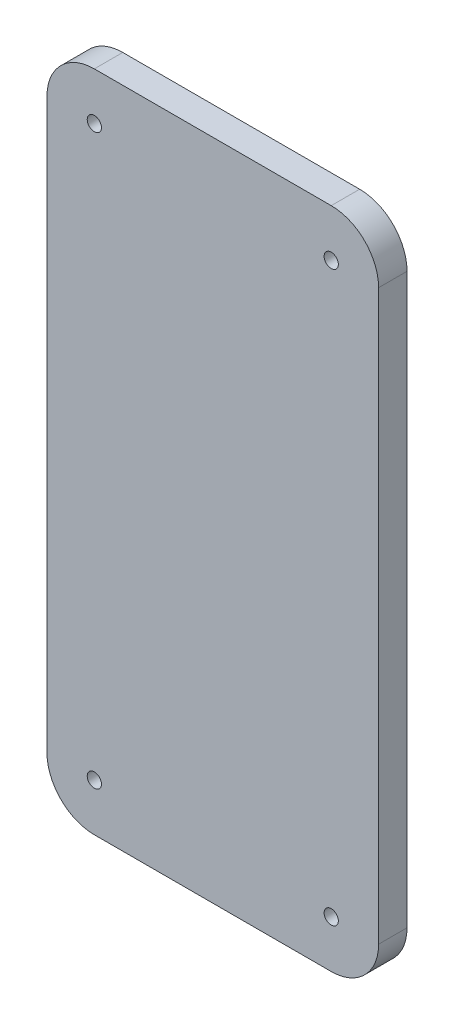
ISO-10303-21;
HEADER;
FILE_DESCRIPTION(('STEP AP214'),'2;1');
FILE_NAME('part.step','',(''),(''),'','','');
FILE_SCHEMA(('AUTOMOTIVE_DESIGN { 1 0 10303 214 1 1 1 1 }'));
ENDSEC;
DATA;
#1=APPLICATION_CONTEXT('core data for automotive mechanical design processes');
#2=APPLICATION_PROTOCOL_DEFINITION('international standard','automotive_design',2000,#1);
#3=PRODUCT_CONTEXT('',#1,'mechanical');
#4=PRODUCT('Part','Part','',(#3));
#5=PRODUCT_RELATED_PRODUCT_CATEGORY('part','',(#4));
#6=PRODUCT_DEFINITION_FORMATION('','',#4);
#7=PRODUCT_DEFINITION_CONTEXT('part definition',#1,'design');
#8=PRODUCT_DEFINITION('design','',#6,#7);
#9=PRODUCT_DEFINITION_SHAPE('','',#8);
#10=(LENGTH_UNIT() NAMED_UNIT(*) SI_UNIT(.MILLI.,.METRE.));
#11=(NAMED_UNIT(*) PLANE_ANGLE_UNIT() SI_UNIT($,.RADIAN.));
#12=(NAMED_UNIT(*) SI_UNIT($,.STERADIAN.) SOLID_ANGLE_UNIT());
#13=UNCERTAINTY_MEASURE_WITH_UNIT(LENGTH_MEASURE(1.E-05),#10,'distance_accuracy_value','');
#14=(GEOMETRIC_REPRESENTATION_CONTEXT(3) GLOBAL_UNCERTAINTY_ASSIGNED_CONTEXT((#13)) GLOBAL_UNIT_ASSIGNED_CONTEXT((#10,
#11,#12)) REPRESENTATION_CONTEXT('',''));
#15=CARTESIAN_POINT('',(0.,0.,0.));
#16=DIRECTION('',(0.,0.,1.));
#17=DIRECTION('',(1.,0.,0.));
#18=AXIS2_PLACEMENT_3D('',#15,#16,#17);
#19=CARTESIAN_POINT('',(-35.,-70.,6.));
#20=DIRECTION('',(1.,0.,0.));
#21=DIRECTION('',(0.,0.,-1.));
#22=AXIS2_PLACEMENT_3D('',#19,#20,#21);
#23=PLANE('',#22);
#24=DIRECTION('',(0.,-1.,0.));
#25=VECTOR('',#24,1.);
#26=CARTESIAN_POINT('',(-35.,-70.,0.));
#27=LINE('',#26,#25);
#28=CARTESIAN_POINT('',(-35.,60.,0.));
#29=VERTEX_POINT('',#28);
#30=CARTESIAN_POINT('',(-35.,-60.,0.));
#31=VERTEX_POINT('',#30);
#32=EDGE_CURVE('E127',#29,#31,#27,.T.);
#33=ORIENTED_EDGE('',*,*,#32,.T.);
#34=DIRECTION('',(0.,0.,-1.));
#35=VECTOR('',#34,1.);
#36=CARTESIAN_POINT('',(-35.,-60.,6.));
#37=LINE('',#36,#35);
#38=CARTESIAN_POINT('',(-35.,-60.,6.));
#39=VERTEX_POINT('',#38);
#40=EDGE_CURVE('E150',#31,#39,#37,.F.);
#41=ORIENTED_EDGE('',*,*,#40,.T.);
#42=DIRECTION('',(0.,-1.,0.));
#43=VECTOR('',#42,1.);
#44=CARTESIAN_POINT('',(-35.,-70.,6.));
#45=LINE('',#44,#43);
#46=CARTESIAN_POINT('',(-35.,60.,6.));
#47=VERTEX_POINT('',#46);
#48=EDGE_CURVE('E125',#47,#39,#45,.T.);
#49=ORIENTED_EDGE('',*,*,#48,.F.);
#50=DIRECTION('',(0.,0.,-1.));
#51=VECTOR('',#50,1.);
#52=CARTESIAN_POINT('',(-35.,60.,6.));
#53=LINE('',#52,#51);
#54=EDGE_CURVE('E147',#47,#29,#53,.T.);
#55=ORIENTED_EDGE('',*,*,#54,.T.);
#56=EDGE_LOOP('',(#33,#41,#49,#55));
#57=FACE_BOUND('',#56,.T.);
#58=ADVANCED_FACE('F32',(#57),#23,.F.);
#59=CARTESIAN_POINT('',(35.,-70.,6.));
#60=DIRECTION('',(0.,1.,0.));
#61=DIRECTION('',(-1.,0.,0.));
#62=AXIS2_PLACEMENT_3D('',#59,#60,#61);
#63=PLANE('',#62);
#64=DIRECTION('',(1.,0.,0.));
#65=VECTOR('',#64,1.);
#66=CARTESIAN_POINT('',(35.,-70.,0.));
#67=LINE('',#66,#65);
#68=CARTESIAN_POINT('',(-25.,-70.,0.));
#69=VERTEX_POINT('',#68);
#70=CARTESIAN_POINT('',(25.,-70.,0.));
#71=VERTEX_POINT('',#70);
#72=EDGE_CURVE('E123',#69,#71,#67,.T.);
#73=ORIENTED_EDGE('',*,*,#72,.T.);
#74=DIRECTION('',(0.,0.,-1.));
#75=VECTOR('',#74,1.);
#76=CARTESIAN_POINT('',(25.,-70.,6.));
#77=LINE('',#76,#75);
#78=CARTESIAN_POINT('',(25.,-70.,6.));
#79=VERTEX_POINT('',#78);
#80=EDGE_CURVE('E102',#71,#79,#77,.F.);
#81=ORIENTED_EDGE('',*,*,#80,.T.);
#82=DIRECTION('',(1.,0.,0.));
#83=VECTOR('',#82,1.);
#84=CARTESIAN_POINT('',(35.,-70.,6.));
#85=LINE('',#84,#83);
#86=CARTESIAN_POINT('',(-25.,-70.,6.));
#87=VERTEX_POINT('',#86);
#88=EDGE_CURVE('E166',#87,#79,#85,.T.);
#89=ORIENTED_EDGE('',*,*,#88,.F.);
#90=DIRECTION('',(0.,0.,-1.));
#91=VECTOR('',#90,1.);
#92=CARTESIAN_POINT('',(-25.,-70.,6.));
#93=LINE('',#92,#91);
#94=EDGE_CURVE('E107',#87,#69,#93,.T.);
#95=ORIENTED_EDGE('',*,*,#94,.T.);
#96=EDGE_LOOP('',(#73,#81,#89,#95));
#97=FACE_BOUND('',#96,.T.);
#98=ADVANCED_FACE('F221',(#97),#63,.F.);
#99=CARTESIAN_POINT('',(35.,-70.,6.));
#100=DIRECTION('',(-1.,0.,0.));
#101=DIRECTION('',(0.,-1.,0.));
#102=AXIS2_PLACEMENT_3D('',#99,#100,#101);
#103=PLANE('',#102);
#104=DIRECTION('',(0.,1.,0.));
#105=VECTOR('',#104,1.);
#106=CARTESIAN_POINT('',(35.,-70.,6.));
#107=LINE('',#106,#105);
#108=CARTESIAN_POINT('',(35.,-60.,6.));
#109=VERTEX_POINT('',#108);
#110=CARTESIAN_POINT('',(35.,60.,6.));
#111=VERTEX_POINT('',#110);
#112=EDGE_CURVE('E116',#109,#111,#107,.T.);
#113=ORIENTED_EDGE('',*,*,#112,.F.);
#114=DIRECTION('',(0.,0.,-1.));
#115=VECTOR('',#114,1.);
#116=CARTESIAN_POINT('',(35.,-60.,6.));
#117=LINE('',#116,#115);
#118=CARTESIAN_POINT('',(35.,-60.,0.));
#119=VERTEX_POINT('',#118);
#120=EDGE_CURVE('E101',#109,#119,#117,.T.);
#121=ORIENTED_EDGE('',*,*,#120,.T.);
#122=DIRECTION('',(0.,1.,0.));
#123=VECTOR('',#122,1.);
#124=CARTESIAN_POINT('',(35.,-70.,0.));
#125=LINE('',#124,#123);
#126=CARTESIAN_POINT('',(35.,60.,0.));
#127=VERTEX_POINT('',#126);
#128=EDGE_CURVE('E114',#119,#127,#125,.T.);
#129=ORIENTED_EDGE('',*,*,#128,.T.);
#130=DIRECTION('',(0.,0.,-1.));
#131=VECTOR('',#130,1.);
#132=CARTESIAN_POINT('',(35.,60.,6.));
#133=LINE('',#132,#131);
#134=EDGE_CURVE('E118',#127,#111,#133,.F.);
#135=ORIENTED_EDGE('',*,*,#134,.T.);
#136=EDGE_LOOP('',(#113,#121,#129,#135));
#137=FACE_BOUND('',#136,.T.);
#138=ADVANCED_FACE('F113',(#137),#103,.F.);
#139=CARTESIAN_POINT('',(35.,70.,6.));
#140=DIRECTION('',(0.,-1.,0.));
#141=DIRECTION('',(1.,0.,0.));
#142=AXIS2_PLACEMENT_3D('',#139,#140,#141);
#143=PLANE('',#142);
#144=DIRECTION('',(-1.,0.,0.));
#145=VECTOR('',#144,1.);
#146=CARTESIAN_POINT('',(35.,70.,0.));
#147=LINE('',#146,#145);
#148=CARTESIAN_POINT('',(25.,70.,0.));
#149=VERTEX_POINT('',#148);
#150=CARTESIAN_POINT('',(-25.,70.,0.));
#151=VERTEX_POINT('',#150);
#152=EDGE_CURVE('E122',#149,#151,#147,.T.);
#153=ORIENTED_EDGE('',*,*,#152,.T.);
#154=DIRECTION('',(0.,0.,-1.));
#155=VECTOR('',#154,1.);
#156=CARTESIAN_POINT('',(-25.,70.,6.));
#157=LINE('',#156,#155);
#158=CARTESIAN_POINT('',(-25.,70.,6.));
#159=VERTEX_POINT('',#158);
#160=EDGE_CURVE('E11',#151,#159,#157,.F.);
#161=ORIENTED_EDGE('',*,*,#160,.T.);
#162=DIRECTION('',(-1.,0.,0.));
#163=VECTOR('',#162,1.);
#164=CARTESIAN_POINT('',(35.,70.,6.));
#165=LINE('',#164,#163);
#166=CARTESIAN_POINT('',(25.,70.,6.));
#167=VERTEX_POINT('',#166);
#168=EDGE_CURVE('E131',#167,#159,#165,.T.);
#169=ORIENTED_EDGE('',*,*,#168,.F.);
#170=DIRECTION('',(0.,0.,-1.));
#171=VECTOR('',#170,1.);
#172=CARTESIAN_POINT('',(25.,70.,6.));
#173=LINE('',#172,#171);
#174=EDGE_CURVE('E40',#167,#149,#173,.T.);
#175=ORIENTED_EDGE('',*,*,#174,.T.);
#176=EDGE_LOOP('',(#153,#161,#169,#175));
#177=FACE_BOUND('',#176,.T.);
#178=ADVANCED_FACE('F153',(#177),#143,.F.);
#179=CARTESIAN_POINT('',(0.,0.,6.));
#180=DIRECTION('',(0.,0.,1.));
#181=DIRECTION('',(1.,0.,0.));
#182=AXIS2_PLACEMENT_3D('',#179,#180,#181);
#183=PLANE('',#182);
#184=CARTESIAN_POINT('',(25.,60.,6.));
#185=DIRECTION('',(0.,0.,1.));
#186=DIRECTION('',(1.,0.,0.));
#187=AXIS2_PLACEMENT_3D('',#184,#185,#186);
#188=CIRCLE('',#187,1.5);
#189=CARTESIAN_POINT('',(26.5,60.,6.));
#190=VERTEX_POINT('',#189);
#191=EDGE_CURVE('E194',#190,#190,#188,.T.);
#192=ORIENTED_EDGE('',*,*,#191,.F.);
#193=EDGE_LOOP('',(#192));
#194=FACE_BOUND('',#193,.T.);
#195=CARTESIAN_POINT('',(25.,-60.,6.));
#196=DIRECTION('',(0.,0.,1.));
#197=DIRECTION('',(1.,0.,0.));
#198=AXIS2_PLACEMENT_3D('',#195,#196,#197);
#199=CIRCLE('',#198,1.5);
#200=CARTESIAN_POINT('',(26.5,-60.,6.));
#201=VERTEX_POINT('',#200);
#202=EDGE_CURVE('E188',#201,#201,#199,.T.);
#203=ORIENTED_EDGE('',*,*,#202,.F.);
#204=EDGE_LOOP('',(#203));
#205=FACE_BOUND('',#204,.T.);
#206=CARTESIAN_POINT('',(-25.,-60.,6.));
#207=DIRECTION('',(0.,0.,1.));
#208=DIRECTION('',(1.,0.,0.));
#209=AXIS2_PLACEMENT_3D('',#206,#207,#208);
#210=CIRCLE('',#209,1.5);
#211=CARTESIAN_POINT('',(-23.5,-60.,6.));
#212=VERTEX_POINT('',#211);
#213=EDGE_CURVE('E182',#212,#212,#210,.T.);
#214=ORIENTED_EDGE('',*,*,#213,.F.);
#215=EDGE_LOOP('',(#214));
#216=FACE_BOUND('',#215,.T.);
#217=CARTESIAN_POINT('',(-25.,60.,6.));
#218=DIRECTION('',(0.,0.,1.));
#219=DIRECTION('',(1.,0.,0.));
#220=AXIS2_PLACEMENT_3D('',#217,#218,#219);
#221=CIRCLE('',#220,1.5);
#222=CARTESIAN_POINT('',(-23.5,60.,6.));
#223=VERTEX_POINT('',#222);
#224=EDGE_CURVE('E171',#223,#223,#221,.T.);
#225=ORIENTED_EDGE('',*,*,#224,.F.);
#226=EDGE_LOOP('',(#225));
#227=FACE_BOUND('',#226,.T.);
#228=ORIENTED_EDGE('',*,*,#88,.T.);
#229=CARTESIAN_POINT('',(25.,-60.,6.));
#230=DIRECTION('',(0.,0.,1.));
#231=DIRECTION('',(1.,0.,0.));
#232=AXIS2_PLACEMENT_3D('',#229,#230,#231);
#233=CIRCLE('',#232,10.);
#234=EDGE_CURVE('E145',#79,#109,#233,.T.);
#235=ORIENTED_EDGE('',*,*,#234,.T.);
#236=ORIENTED_EDGE('',*,*,#112,.T.);
#237=CARTESIAN_POINT('',(25.,60.,6.));
#238=DIRECTION('',(0.,0.,1.));
#239=DIRECTION('',(1.,0.,0.));
#240=AXIS2_PLACEMENT_3D('',#237,#238,#239);
#241=CIRCLE('',#240,10.);
#242=EDGE_CURVE('E52',#111,#167,#241,.T.);
#243=ORIENTED_EDGE('',*,*,#242,.T.);
#244=ORIENTED_EDGE('',*,*,#168,.T.);
#245=CARTESIAN_POINT('',(-25.,60.,6.));
#246=DIRECTION('',(0.,0.,1.));
#247=DIRECTION('',(1.,0.,0.));
#248=AXIS2_PLACEMENT_3D('',#245,#246,#247);
#249=CIRCLE('',#248,10.);
#250=EDGE_CURVE('E141',#159,#47,#249,.T.);
#251=ORIENTED_EDGE('',*,*,#250,.T.);
#252=ORIENTED_EDGE('',*,*,#48,.T.);
#253=CARTESIAN_POINT('',(-25.,-60.,6.));
#254=DIRECTION('',(0.,0.,1.));
#255=DIRECTION('',(1.,0.,0.));
#256=AXIS2_PLACEMENT_3D('',#253,#254,#255);
#257=CIRCLE('',#256,10.);
#258=EDGE_CURVE('E143',#39,#87,#257,.T.);
#259=ORIENTED_EDGE('',*,*,#258,.T.);
#260=EDGE_LOOP('',(#228,#235,#236,#243,#244,#251,#252,#259));
#261=FACE_BOUND('',#260,.T.);
#262=ADVANCED_FACE('F209',(#194,#205,#216,#227,#261),#183,.T.);
#263=CARTESIAN_POINT('',(0.,0.,0.));
#264=DIRECTION('',(0.,0.,1.));
#265=DIRECTION('',(1.,0.,0.));
#266=AXIS2_PLACEMENT_3D('',#263,#264,#265);
#267=PLANE('',#266);
#268=CARTESIAN_POINT('',(25.,60.,0.));
#269=DIRECTION('',(0.,0.,1.));
#270=DIRECTION('',(1.,0.,0.));
#271=AXIS2_PLACEMENT_3D('',#268,#269,#270);
#272=CIRCLE('',#271,1.5);
#273=CARTESIAN_POINT('',(26.5,60.,0.));
#274=VERTEX_POINT('',#273);
#275=EDGE_CURVE('E180',#274,#274,#272,.T.);
#276=ORIENTED_EDGE('',*,*,#275,.T.);
#277=EDGE_LOOP('',(#276));
#278=FACE_BOUND('',#277,.T.);
#279=CARTESIAN_POINT('',(25.,-60.,0.));
#280=DIRECTION('',(0.,0.,1.));
#281=DIRECTION('',(1.,0.,0.));
#282=AXIS2_PLACEMENT_3D('',#279,#280,#281);
#283=CIRCLE('',#282,1.5);
#284=CARTESIAN_POINT('',(26.5,-60.,0.));
#285=VERTEX_POINT('',#284);
#286=EDGE_CURVE('E191',#285,#285,#283,.T.);
#287=ORIENTED_EDGE('',*,*,#286,.T.);
#288=EDGE_LOOP('',(#287));
#289=FACE_BOUND('',#288,.T.);
#290=CARTESIAN_POINT('',(-25.,-60.,0.));
#291=DIRECTION('',(0.,0.,1.));
#292=DIRECTION('',(1.,0.,0.));
#293=AXIS2_PLACEMENT_3D('',#290,#291,#292);
#294=CIRCLE('',#293,1.5);
#295=CARTESIAN_POINT('',(-23.5,-60.,0.));
#296=VERTEX_POINT('',#295);
#297=EDGE_CURVE('E185',#296,#296,#294,.T.);
#298=ORIENTED_EDGE('',*,*,#297,.T.);
#299=EDGE_LOOP('',(#298));
#300=FACE_BOUND('',#299,.T.);
#301=CARTESIAN_POINT('',(-25.,60.,0.));
#302=DIRECTION('',(0.,0.,1.));
#303=DIRECTION('',(1.,0.,0.));
#304=AXIS2_PLACEMENT_3D('',#301,#302,#303);
#305=CIRCLE('',#304,1.5);
#306=CARTESIAN_POINT('',(-23.5,60.,0.));
#307=VERTEX_POINT('',#306);
#308=EDGE_CURVE('E175',#307,#307,#305,.T.);
#309=ORIENTED_EDGE('',*,*,#308,.T.);
#310=EDGE_LOOP('',(#309));
#311=FACE_BOUND('',#310,.T.);
#312=ORIENTED_EDGE('',*,*,#128,.F.);
#313=CARTESIAN_POINT('',(25.,-60.,0.));
#314=DIRECTION('',(0.,0.,1.));
#315=DIRECTION('',(1.,0.,0.));
#316=AXIS2_PLACEMENT_3D('',#313,#314,#315);
#317=CIRCLE('',#316,10.);
#318=EDGE_CURVE('E97',#119,#71,#317,.F.);
#319=ORIENTED_EDGE('',*,*,#318,.T.);
#320=ORIENTED_EDGE('',*,*,#72,.F.);
#321=CARTESIAN_POINT('',(-25.,-60.,0.));
#322=DIRECTION('',(0.,0.,1.));
#323=DIRECTION('',(1.,0.,0.));
#324=AXIS2_PLACEMENT_3D('',#321,#322,#323);
#325=CIRCLE('',#324,10.);
#326=EDGE_CURVE('E108',#69,#31,#325,.F.);
#327=ORIENTED_EDGE('',*,*,#326,.T.);
#328=ORIENTED_EDGE('',*,*,#32,.F.);
#329=CARTESIAN_POINT('',(-25.,60.,0.));
#330=DIRECTION('',(0.,0.,1.));
#331=DIRECTION('',(1.,0.,0.));
#332=AXIS2_PLACEMENT_3D('',#329,#330,#331);
#333=CIRCLE('',#332,10.);
#334=EDGE_CURVE('E134',#29,#151,#333,.F.);
#335=ORIENTED_EDGE('',*,*,#334,.T.);
#336=ORIENTED_EDGE('',*,*,#152,.F.);
#337=CARTESIAN_POINT('',(25.,60.,0.));
#338=DIRECTION('',(0.,0.,1.));
#339=DIRECTION('',(1.,0.,0.));
#340=AXIS2_PLACEMENT_3D('',#337,#338,#339);
#341=CIRCLE('',#340,10.);
#342=EDGE_CURVE('E117',#149,#127,#341,.F.);
#343=ORIENTED_EDGE('',*,*,#342,.T.);
#344=EDGE_LOOP('',(#312,#319,#320,#327,#328,#335,#336,#343));
#345=FACE_BOUND('',#344,.T.);
#346=ADVANCED_FACE('F120',(#278,#289,#300,#311,#345),#267,.F.);
#347=CARTESIAN_POINT('',(25.,-60.,6.));
#348=DIRECTION('',(0.,0.,-1.));
#349=DIRECTION('',(-1.,0.,0.));
#350=AXIS2_PLACEMENT_3D('',#347,#348,#349);
#351=CYLINDRICAL_SURFACE('',#350,10.);
#352=ORIENTED_EDGE('',*,*,#234,.F.);
#353=ORIENTED_EDGE('',*,*,#80,.F.);
#354=ORIENTED_EDGE('',*,*,#318,.F.);
#355=ORIENTED_EDGE('',*,*,#120,.F.);
#356=EDGE_LOOP('',(#352,#353,#354,#355));
#357=FACE_BOUND('',#356,.T.);
#358=ADVANCED_FACE('F100',(#357),#351,.T.);
#359=CARTESIAN_POINT('',(-25.,-60.,6.));
#360=DIRECTION('',(0.,0.,-1.));
#361=DIRECTION('',(-1.,0.,0.));
#362=AXIS2_PLACEMENT_3D('',#359,#360,#361);
#363=CYLINDRICAL_SURFACE('',#362,10.);
#364=ORIENTED_EDGE('',*,*,#258,.F.);
#365=ORIENTED_EDGE('',*,*,#40,.F.);
#366=ORIENTED_EDGE('',*,*,#326,.F.);
#367=ORIENTED_EDGE('',*,*,#94,.F.);
#368=EDGE_LOOP('',(#364,#365,#366,#367));
#369=FACE_BOUND('',#368,.T.);
#370=ADVANCED_FACE('F223',(#369),#363,.T.);
#371=CARTESIAN_POINT('',(-25.,60.,6.));
#372=DIRECTION('',(0.,0.,-1.));
#373=DIRECTION('',(-1.,0.,0.));
#374=AXIS2_PLACEMENT_3D('',#371,#372,#373);
#375=CYLINDRICAL_SURFACE('',#374,10.);
#376=ORIENTED_EDGE('',*,*,#250,.F.);
#377=ORIENTED_EDGE('',*,*,#160,.F.);
#378=ORIENTED_EDGE('',*,*,#334,.F.);
#379=ORIENTED_EDGE('',*,*,#54,.F.);
#380=EDGE_LOOP('',(#376,#377,#378,#379));
#381=FACE_BOUND('',#380,.T.);
#382=ADVANCED_FACE('F160',(#381),#375,.T.);
#383=CARTESIAN_POINT('',(25.,60.,6.));
#384=DIRECTION('',(0.,0.,-1.));
#385=DIRECTION('',(-1.,0.,0.));
#386=AXIS2_PLACEMENT_3D('',#383,#384,#385);
#387=CYLINDRICAL_SURFACE('',#386,10.);
#388=ORIENTED_EDGE('',*,*,#242,.F.);
#389=ORIENTED_EDGE('',*,*,#134,.F.);
#390=ORIENTED_EDGE('',*,*,#342,.F.);
#391=ORIENTED_EDGE('',*,*,#174,.F.);
#392=EDGE_LOOP('',(#388,#389,#390,#391));
#393=FACE_BOUND('',#392,.T.);
#394=ADVANCED_FACE('F34',(#393),#387,.T.);
#395=CARTESIAN_POINT('',(-25.,60.,0.));
#396=DIRECTION('',(0.,0.,1.));
#397=DIRECTION('',(1.,0.,0.));
#398=AXIS2_PLACEMENT_3D('',#395,#396,#397);
#399=CYLINDRICAL_SURFACE('',#398,1.5);
#400=ORIENTED_EDGE('',*,*,#308,.F.);
#401=EDGE_LOOP('',(#400));
#402=FACE_BOUND('',#401,.T.);
#403=ORIENTED_EDGE('',*,*,#224,.T.);
#404=EDGE_LOOP('',(#403));
#405=FACE_BOUND('',#404,.T.);
#406=ADVANCED_FACE('F244',(#402,#405),#399,.F.);
#407=CARTESIAN_POINT('',(-25.,-60.,0.));
#408=DIRECTION('',(0.,0.,1.));
#409=DIRECTION('',(1.,0.,0.));
#410=AXIS2_PLACEMENT_3D('',#407,#408,#409);
#411=CYLINDRICAL_SURFACE('',#410,1.5);
#412=ORIENTED_EDGE('',*,*,#297,.F.);
#413=EDGE_LOOP('',(#412));
#414=FACE_BOUND('',#413,.T.);
#415=ORIENTED_EDGE('',*,*,#213,.T.);
#416=EDGE_LOOP('',(#415));
#417=FACE_BOUND('',#416,.T.);
#418=ADVANCED_FACE('F247',(#414,#417),#411,.F.);
#419=CARTESIAN_POINT('',(25.,-60.,0.));
#420=DIRECTION('',(0.,0.,1.));
#421=DIRECTION('',(1.,0.,0.));
#422=AXIS2_PLACEMENT_3D('',#419,#420,#421);
#423=CYLINDRICAL_SURFACE('',#422,1.5);
#424=ORIENTED_EDGE('',*,*,#286,.F.);
#425=EDGE_LOOP('',(#424));
#426=FACE_BOUND('',#425,.T.);
#427=ORIENTED_EDGE('',*,*,#202,.T.);
#428=EDGE_LOOP('',(#427));
#429=FACE_BOUND('',#428,.T.);
#430=ADVANCED_FACE('F205',(#426,#429),#423,.F.);
#431=CARTESIAN_POINT('',(25.,60.,0.));
#432=DIRECTION('',(0.,0.,1.));
#433=DIRECTION('',(1.,0.,0.));
#434=AXIS2_PLACEMENT_3D('',#431,#432,#433);
#435=CYLINDRICAL_SURFACE('',#434,1.5);
#436=ORIENTED_EDGE('',*,*,#275,.F.);
#437=EDGE_LOOP('',(#436));
#438=FACE_BOUND('',#437,.T.);
#439=ORIENTED_EDGE('',*,*,#191,.T.);
#440=EDGE_LOOP('',(#439));
#441=FACE_BOUND('',#440,.T.);
#442=ADVANCED_FACE('F202',(#438,#441),#435,.F.);
#443=CLOSED_SHELL('',(#58,#98,#138,#178,#262,#346,#358,#370,#382,#394,#406,#418,#430,#442));
#444=MANIFOLD_SOLID_BREP('B2',#443);
#445=ADVANCED_BREP_SHAPE_REPRESENTATION('',(#18,#444),#14);
#446=SHAPE_DEFINITION_REPRESENTATION(#9,#445);
ENDSEC;
END-ISO-10303-21;
